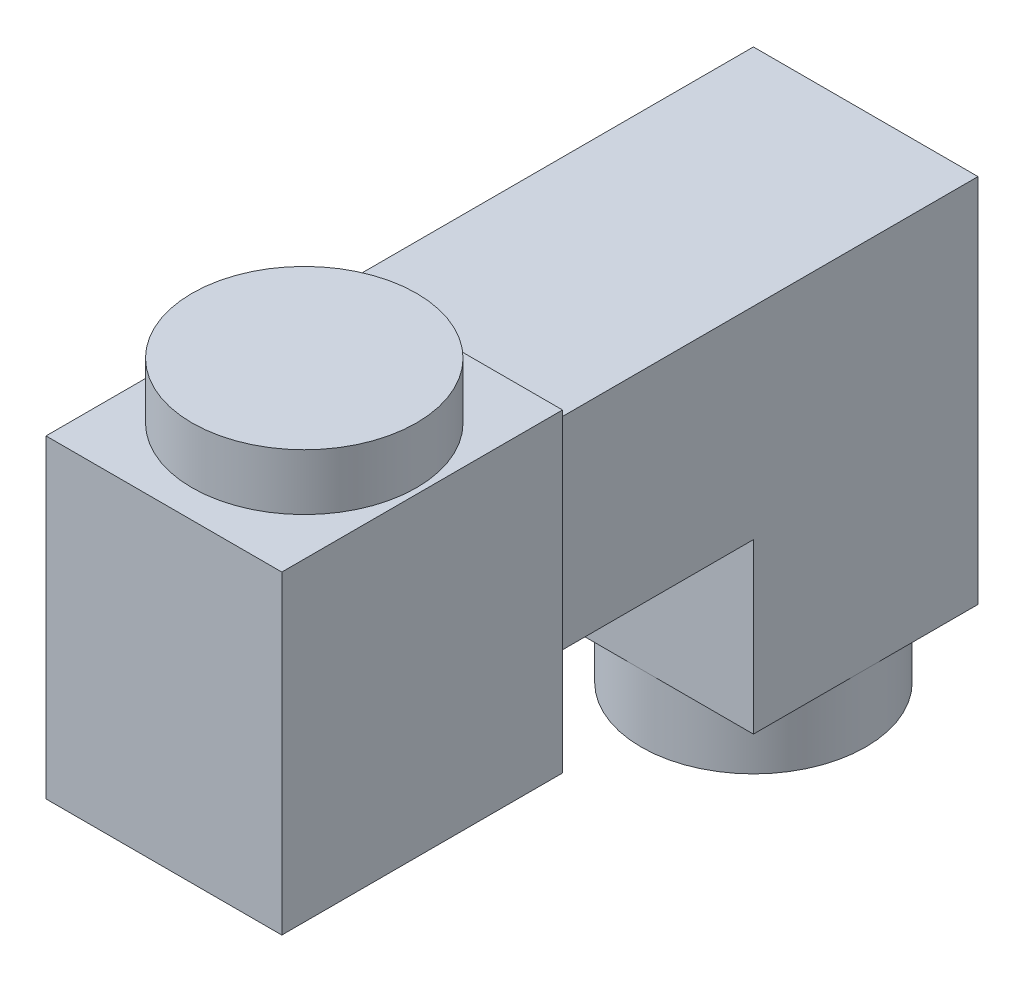
ISO-10303-21;
HEADER;
FILE_DESCRIPTION(('STEP AP214'),'2;1');
FILE_NAME('part.step','',(''),(''),'','','');
FILE_SCHEMA(('AUTOMOTIVE_DESIGN { 1 0 10303 214 1 1 1 1 }'));
ENDSEC;
DATA;
#1=APPLICATION_CONTEXT('core data for automotive mechanical design processes');
#2=APPLICATION_PROTOCOL_DEFINITION('international standard','automotive_design',2000,#1);
#3=PRODUCT_CONTEXT('',#1,'mechanical');
#4=PRODUCT('Part','Part','',(#3));
#5=PRODUCT_RELATED_PRODUCT_CATEGORY('part','',(#4));
#6=PRODUCT_DEFINITION_FORMATION('','',#4);
#7=PRODUCT_DEFINITION_CONTEXT('part definition',#1,'design');
#8=PRODUCT_DEFINITION('design','',#6,#7);
#9=PRODUCT_DEFINITION_SHAPE('','',#8);
#10=(LENGTH_UNIT() NAMED_UNIT(*) SI_UNIT(.MILLI.,.METRE.));
#11=(NAMED_UNIT(*) PLANE_ANGLE_UNIT() SI_UNIT($,.RADIAN.));
#12=(NAMED_UNIT(*) SI_UNIT($,.STERADIAN.) SOLID_ANGLE_UNIT());
#13=UNCERTAINTY_MEASURE_WITH_UNIT(LENGTH_MEASURE(1.E-05),#10,'distance_accuracy_value','');
#14=(GEOMETRIC_REPRESENTATION_CONTEXT(3) GLOBAL_UNCERTAINTY_ASSIGNED_CONTEXT((#13)) GLOBAL_UNIT_ASSIGNED_CONTEXT((#10,
#11,#12)) REPRESENTATION_CONTEXT('',''));
#15=CARTESIAN_POINT('',(0.,0.,0.));
#16=DIRECTION('',(0.,0.,1.));
#17=DIRECTION('',(1.,0.,0.));
#18=AXIS2_PLACEMENT_3D('',#15,#16,#17);
#19=CARTESIAN_POINT('',(0.,149.300046999142,0.));
#20=DIRECTION('',(0.,-1.,0.));
#21=DIRECTION('',(0.,0.,-1.));
#22=AXIS2_PLACEMENT_3D('',#19,#20,#21);
#23=PLANE('',#22);
#24=CARTESIAN_POINT('',(10.5,149.300046999142,-196.893217971225));
#25=DIRECTION('',(0.,-1.,0.));
#26=DIRECTION('',(0.,0.,-1.));
#27=AXIS2_PLACEMENT_3D('',#24,#25,#26);
#28=CIRCLE('',#27,10.);
#29=CARTESIAN_POINT('',(10.5,149.300046999142,-206.893217971225));
#30=VERTEX_POINT('',#29);
#31=CARTESIAN_POINT('',(20.5,149.300046999142,-196.893217971225));
#32=VERTEX_POINT('',#31);
#33=EDGE_CURVE('E43',#30,#32,#28,.T.);
#34=ORIENTED_EDGE('',*,*,#33,.F.);
#35=DIRECTION('',(1.,0.,0.));
#36=VECTOR('',#35,1.);
#37=CARTESIAN_POINT('',(0.499999999999995,149.300046999142,-206.893217971225));
#38=LINE('',#37,#36);
#39=CARTESIAN_POINT('',(20.5,149.300046999142,-206.893217971225));
#40=VERTEX_POINT('',#39);
#41=EDGE_CURVE('E132',#30,#40,#38,.T.);
#42=ORIENTED_EDGE('',*,*,#41,.T.);
#43=DIRECTION('',(0.,0.,1.));
#44=VECTOR('',#43,1.);
#45=CARTESIAN_POINT('',(20.5,149.300046999142,-186.893217971225));
#46=LINE('',#45,#44);
#47=EDGE_CURVE('E144',#40,#32,#46,.T.);
#48=ORIENTED_EDGE('',*,*,#47,.T.);
#49=EDGE_LOOP('',(#34,#42,#48));
#50=FACE_BOUND('',#49,.T.);
#51=ADVANCED_FACE('F32',(#50),#23,.T.);
#52=CARTESIAN_POINT('',(10.5,149.300046999142,-186.893217971225));
#53=VERTEX_POINT('',#52);
#54=EDGE_CURVE('E11',#32,#53,#28,.T.);
#55=ORIENTED_EDGE('',*,*,#54,.F.);
#56=CARTESIAN_POINT('',(20.5,149.300046999142,-186.893217971225));
#57=VERTEX_POINT('',#56);
#58=EDGE_CURVE('E131',#32,#57,#46,.T.);
#59=ORIENTED_EDGE('',*,*,#58,.T.);
#60=DIRECTION('',(-1.,0.,0.));
#61=VECTOR('',#60,1.);
#62=CARTESIAN_POINT('',(0.499999999999995,149.300046999142,-186.893217971225));
#63=LINE('',#62,#61);
#64=EDGE_CURVE('E160',#57,#53,#63,.T.);
#65=ORIENTED_EDGE('',*,*,#64,.T.);
#66=EDGE_LOOP('',(#55,#59,#65));
#67=FACE_BOUND('',#66,.T.);
#68=ADVANCED_FACE('F255',(#67),#23,.T.);
#69=CARTESIAN_POINT('',(0.499999999999995,149.300046999142,-196.893217971225));
#70=VERTEX_POINT('',#69);
#71=EDGE_CURVE('E41',#53,#70,#28,.T.);
#72=ORIENTED_EDGE('',*,*,#71,.F.);
#73=CARTESIAN_POINT('',(0.499999999999995,149.300046999142,-186.893217971225));
#74=VERTEX_POINT('',#73);
#75=EDGE_CURVE('E159',#53,#74,#63,.T.);
#76=ORIENTED_EDGE('',*,*,#75,.T.);
#77=DIRECTION('',(0.,0.,-1.));
#78=VECTOR('',#77,1.);
#79=CARTESIAN_POINT('',(0.499999999999995,149.300046999142,-186.893217971225));
#80=LINE('',#79,#78);
#81=EDGE_CURVE('E142',#74,#70,#80,.T.);
#82=ORIENTED_EDGE('',*,*,#81,.T.);
#83=EDGE_LOOP('',(#72,#76,#82));
#84=FACE_BOUND('',#83,.T.);
#85=ADVANCED_FACE('F260',(#84),#23,.T.);
#86=CARTESIAN_POINT('',(20.5,164.300046999142,-206.893217971225));
#87=DIRECTION('',(0.,1.,0.));
#88=DIRECTION('',(0.,0.,1.));
#89=AXIS2_PLACEMENT_3D('',#86,#87,#88);
#90=PLANE('',#89);
#91=DIRECTION('',(-1.,0.,0.));
#92=VECTOR('',#91,1.);
#93=CARTESIAN_POINT('',(0.499999999999995,164.300046999142,-186.893217971225));
#94=LINE('',#93,#92);
#95=CARTESIAN_POINT('',(20.5,164.300046999142,-186.893217971225));
#96=VERTEX_POINT('',#95);
#97=CARTESIAN_POINT('',(0.499999999999995,164.300046999142,-186.893217971225));
#98=VERTEX_POINT('',#97);
#99=EDGE_CURVE('E155',#96,#98,#94,.T.);
#100=ORIENTED_EDGE('',*,*,#99,.F.);
#101=DIRECTION('',(0.,0.,1.));
#102=VECTOR('',#101,1.);
#103=CARTESIAN_POINT('',(20.5,164.300046999142,-206.893217971225));
#104=LINE('',#103,#102);
#105=CARTESIAN_POINT('',(20.5,164.300046999142,-169.393217971225));
#106=VERTEX_POINT('',#105);
#107=EDGE_CURVE('E193',#96,#106,#104,.T.);
#108=ORIENTED_EDGE('',*,*,#107,.T.);
#109=DIRECTION('',(-1.,0.,0.));
#110=VECTOR('',#109,1.);
#111=CARTESIAN_POINT('',(20.5,164.300046999142,-169.393217971225));
#112=LINE('',#111,#110);
#113=CARTESIAN_POINT('',(0.499999999999995,164.300046999142,-169.393217971225));
#114=VERTEX_POINT('',#113);
#115=EDGE_CURVE('E178',#106,#114,#112,.T.);
#116=ORIENTED_EDGE('',*,*,#115,.T.);
#117=DIRECTION('',(0.,0.,1.));
#118=VECTOR('',#117,1.);
#119=CARTESIAN_POINT('',(0.499999999999995,164.300046999142,-206.893217971225));
#120=LINE('',#119,#118);
#121=EDGE_CURVE('E191',#98,#114,#120,.T.);
#122=ORIENTED_EDGE('',*,*,#121,.F.);
#123=EDGE_LOOP('',(#100,#108,#116,#122));
#124=FACE_BOUND('',#123,.T.);
#125=ADVANCED_FACE('F274',(#124),#90,.F.);
#126=CARTESIAN_POINT('',(21.,155.300046999142,-169.393217971225));
#127=DIRECTION('',(0.,0.,1.));
#128=DIRECTION('',(1.,0.,0.));
#129=AXIS2_PLACEMENT_3D('',#126,#127,#128);
#130=PLANE('',#129);
#131=DIRECTION('',(0.,1.,0.));
#132=VECTOR('',#131,1.);
#133=CARTESIAN_POINT('',(0.,155.300046999142,-169.393217971225));
#134=LINE('',#133,#132);
#135=CARTESIAN_POINT('',(0.,155.300046999142,-169.393217971225));
#136=VERTEX_POINT('',#135);
#137=CARTESIAN_POINT('',(0.,183.300046999142,-169.393217971225));
#138=VERTEX_POINT('',#137);
#139=EDGE_CURVE('E211',#136,#138,#134,.T.);
#140=ORIENTED_EDGE('',*,*,#139,.T.);
#141=DIRECTION('',(-1.,0.,0.));
#142=VECTOR('',#141,1.);
#143=CARTESIAN_POINT('',(21.,183.300046999142,-169.393217971225));
#144=LINE('',#143,#142);
#145=CARTESIAN_POINT('',(21.,183.300046999142,-169.393217971225));
#146=VERTEX_POINT('',#145);
#147=EDGE_CURVE('E216',#146,#138,#144,.T.);
#148=ORIENTED_EDGE('',*,*,#147,.F.);
#149=DIRECTION('',(0.,1.,0.));
#150=VECTOR('',#149,1.);
#151=CARTESIAN_POINT('',(21.,155.300046999142,-169.393217971225));
#152=LINE('',#151,#150);
#153=CARTESIAN_POINT('',(21.,155.300046999142,-169.393217971225));
#154=VERTEX_POINT('',#153);
#155=EDGE_CURVE('E202',#154,#146,#152,.T.);
#156=ORIENTED_EDGE('',*,*,#155,.F.);
#157=DIRECTION('',(-1.,0.,0.));
#158=VECTOR('',#157,1.);
#159=CARTESIAN_POINT('',(21.,155.300046999142,-169.393217971225));
#160=LINE('',#159,#158);
#161=EDGE_CURVE('E218',#154,#136,#160,.T.);
#162=ORIENTED_EDGE('',*,*,#161,.T.);
#163=EDGE_LOOP('',(#140,#148,#156,#162));
#164=FACE_BOUND('',#163,.T.);
#165=DIRECTION('',(0.,-1.,0.));
#166=VECTOR('',#165,1.);
#167=CARTESIAN_POINT('',(20.5,182.300046999142,-169.393217971225));
#168=LINE('',#167,#166);
#169=CARTESIAN_POINT('',(20.5,182.300046999142,-169.393217971225));
#170=VERTEX_POINT('',#169);
#171=EDGE_CURVE('E168',#170,#106,#168,.T.);
#172=ORIENTED_EDGE('',*,*,#171,.F.);
#173=DIRECTION('',(1.,0.,0.));
#174=VECTOR('',#173,1.);
#175=CARTESIAN_POINT('',(20.5,182.300046999142,-169.393217971225));
#176=LINE('',#175,#174);
#177=CARTESIAN_POINT('',(0.499999999999995,182.300046999142,-169.393217971225));
#178=VERTEX_POINT('',#177);
#179=EDGE_CURVE('E171',#178,#170,#176,.T.);
#180=ORIENTED_EDGE('',*,*,#179,.F.);
#181=DIRECTION('',(0.,1.,0.));
#182=VECTOR('',#181,1.);
#183=CARTESIAN_POINT('',(0.499999999999995,182.300046999142,-169.393217971225));
#184=LINE('',#183,#182);
#185=EDGE_CURVE('E181',#114,#178,#184,.T.);
#186=ORIENTED_EDGE('',*,*,#185,.F.);
#187=ORIENTED_EDGE('',*,*,#115,.F.);
#188=EDGE_LOOP('',(#172,#180,#186,#187));
#189=FACE_BOUND('',#188,.T.);
#190=ADVANCED_FACE('F236',(#164,#189),#130,.F.);
#191=CARTESIAN_POINT('',(21.,155.300046999142,-144.393217971225));
#192=DIRECTION('',(0.,0.,-1.));
#193=DIRECTION('',(-1.,0.,0.));
#194=AXIS2_PLACEMENT_3D('',#191,#192,#193);
#195=PLANE('',#194);
#196=DIRECTION('',(0.,-1.,0.));
#197=VECTOR('',#196,1.);
#198=CARTESIAN_POINT('',(0.,155.300046999142,-144.393217971225));
#199=LINE('',#198,#197);
#200=CARTESIAN_POINT('',(0.,183.300046999142,-144.393217971225));
#201=VERTEX_POINT('',#200);
#202=CARTESIAN_POINT('',(0.,155.300046999142,-144.393217971225));
#203=VERTEX_POINT('',#202);
#204=EDGE_CURVE('E195',#201,#203,#199,.T.);
#205=ORIENTED_EDGE('',*,*,#204,.T.);
#206=DIRECTION('',(-1.,0.,0.));
#207=VECTOR('',#206,1.);
#208=CARTESIAN_POINT('',(21.,155.300046999142,-144.393217971225));
#209=LINE('',#208,#207);
#210=CARTESIAN_POINT('',(21.,155.300046999142,-144.393217971225));
#211=VERTEX_POINT('',#210);
#212=EDGE_CURVE('E36',#211,#203,#209,.T.);
#213=ORIENTED_EDGE('',*,*,#212,.F.);
#214=DIRECTION('',(0.,-1.,0.));
#215=VECTOR('',#214,1.);
#216=CARTESIAN_POINT('',(21.,155.300046999142,-144.393217971225));
#217=LINE('',#216,#215);
#218=CARTESIAN_POINT('',(21.,183.300046999142,-144.393217971225));
#219=VERTEX_POINT('',#218);
#220=EDGE_CURVE('E196',#219,#211,#217,.T.);
#221=ORIENTED_EDGE('',*,*,#220,.F.);
#222=DIRECTION('',(-1.,0.,0.));
#223=VECTOR('',#222,1.);
#224=CARTESIAN_POINT('',(21.,183.300046999142,-144.393217971225));
#225=LINE('',#224,#223);
#226=EDGE_CURVE('E206',#219,#201,#225,.T.);
#227=ORIENTED_EDGE('',*,*,#226,.T.);
#228=EDGE_LOOP('',(#205,#213,#221,#227));
#229=FACE_BOUND('',#228,.T.);
#230=ADVANCED_FACE('F34',(#229),#195,.F.);
#231=CARTESIAN_POINT('',(21.,155.300046999142,-144.393217971225));
#232=DIRECTION('',(0.,1.,0.));
#233=DIRECTION('',(0.,0.,1.));
#234=AXIS2_PLACEMENT_3D('',#231,#232,#233);
#235=PLANE('',#234);
#236=DIRECTION('',(0.,0.,-1.));
#237=VECTOR('',#236,1.);
#238=CARTESIAN_POINT('',(0.,155.300046999142,-144.393217971225));
#239=LINE('',#238,#237);
#240=EDGE_CURVE('E209',#203,#136,#239,.T.);
#241=ORIENTED_EDGE('',*,*,#240,.T.);
#242=ORIENTED_EDGE('',*,*,#161,.F.);
#243=DIRECTION('',(0.,0.,-1.));
#244=VECTOR('',#243,1.);
#245=CARTESIAN_POINT('',(21.,155.300046999142,-144.393217971225));
#246=LINE('',#245,#244);
#247=EDGE_CURVE('E199',#211,#154,#246,.T.);
#248=ORIENTED_EDGE('',*,*,#247,.F.);
#249=ORIENTED_EDGE('',*,*,#212,.T.);
#250=EDGE_LOOP('',(#241,#242,#248,#249));
#251=FACE_BOUND('',#250,.T.);
#252=ADVANCED_FACE('F227',(#251),#235,.F.);
#253=CARTESIAN_POINT('',(21.,183.300046999142,-144.393217971225));
#254=DIRECTION('',(0.,-1.,0.));
#255=DIRECTION('',(0.,0.,-1.));
#256=AXIS2_PLACEMENT_3D('',#253,#254,#255);
#257=PLANE('',#256);
#258=CARTESIAN_POINT('',(10.5,183.300046999142,-156.893217971225));
#259=DIRECTION('',(0.,1.,0.));
#260=DIRECTION('',(0.,0.,1.));
#261=AXIS2_PLACEMENT_3D('',#258,#259,#260);
#262=CIRCLE('',#261,10.);
#263=CARTESIAN_POINT('',(10.5,183.300046999142,-146.893217971225));
#264=VERTEX_POINT('',#263);
#265=EDGE_CURVE('E148',#264,#264,#262,.T.);
#266=ORIENTED_EDGE('',*,*,#265,.F.);
#267=EDGE_LOOP('',(#266));
#268=FACE_BOUND('',#267,.T.);
#269=DIRECTION('',(0.,0.,1.));
#270=VECTOR('',#269,1.);
#271=CARTESIAN_POINT('',(0.,183.300046999142,-144.393217971225));
#272=LINE('',#271,#270);
#273=EDGE_CURVE('E200',#138,#201,#272,.T.);
#274=ORIENTED_EDGE('',*,*,#273,.T.);
#275=ORIENTED_EDGE('',*,*,#226,.F.);
#276=DIRECTION('',(0.,0.,1.));
#277=VECTOR('',#276,1.);
#278=CARTESIAN_POINT('',(21.,183.300046999142,-144.393217971225));
#279=LINE('',#278,#277);
#280=EDGE_CURVE('E204',#146,#219,#279,.T.);
#281=ORIENTED_EDGE('',*,*,#280,.F.);
#282=ORIENTED_EDGE('',*,*,#147,.T.);
#283=EDGE_LOOP('',(#274,#275,#281,#282));
#284=FACE_BOUND('',#283,.T.);
#285=ADVANCED_FACE('F240',(#268,#284),#257,.F.);
#286=CARTESIAN_POINT('',(21.,0.,0.));
#287=DIRECTION('',(-1.,0.,0.));
#288=DIRECTION('',(0.,0.,1.));
#289=AXIS2_PLACEMENT_3D('',#286,#287,#288);
#290=PLANE('',#289);
#291=ORIENTED_EDGE('',*,*,#220,.T.);
#292=ORIENTED_EDGE('',*,*,#247,.T.);
#293=ORIENTED_EDGE('',*,*,#155,.T.);
#294=ORIENTED_EDGE('',*,*,#280,.T.);
#295=EDGE_LOOP('',(#291,#292,#293,#294));
#296=FACE_BOUND('',#295,.T.);
#297=ADVANCED_FACE('F242',(#296),#290,.F.);
#298=CARTESIAN_POINT('',(0.,0.,0.));
#299=DIRECTION('',(-1.,0.,0.));
#300=DIRECTION('',(0.,0.,1.));
#301=AXIS2_PLACEMENT_3D('',#298,#299,#300);
#302=PLANE('',#301);
#303=ORIENTED_EDGE('',*,*,#204,.F.);
#304=ORIENTED_EDGE('',*,*,#273,.F.);
#305=ORIENTED_EDGE('',*,*,#139,.F.);
#306=ORIENTED_EDGE('',*,*,#240,.F.);
#307=EDGE_LOOP('',(#303,#304,#305,#306));
#308=FACE_BOUND('',#307,.T.);
#309=ADVANCED_FACE('F234',(#308),#302,.T.);
#310=CARTESIAN_POINT('',(20.5,182.300046999142,-206.893217971225));
#311=DIRECTION('',(-1.,0.,0.));
#312=DIRECTION('',(0.,-1.,0.));
#313=AXIS2_PLACEMENT_3D('',#310,#311,#312);
#314=PLANE('',#313);
#315=ORIENTED_EDGE('',*,*,#171,.T.);
#316=ORIENTED_EDGE('',*,*,#107,.F.);
#317=DIRECTION('',(0.,1.,0.));
#318=VECTOR('',#317,1.);
#319=CARTESIAN_POINT('',(20.5,149.300046999142,-186.893217971225));
#320=LINE('',#319,#318);
#321=EDGE_CURVE('E166',#57,#96,#320,.T.);
#322=ORIENTED_EDGE('',*,*,#321,.F.);
#323=ORIENTED_EDGE('',*,*,#58,.F.);
#324=ORIENTED_EDGE('',*,*,#47,.F.);
#325=DIRECTION('',(0.,-1.,0.));
#326=VECTOR('',#325,1.);
#327=CARTESIAN_POINT('',(20.5,182.300046999142,-206.893217971225));
#328=LINE('',#327,#326);
#329=CARTESIAN_POINT('',(20.5,182.300046999142,-206.893217971225));
#330=VERTEX_POINT('',#329);
#331=EDGE_CURVE('E138',#330,#40,#328,.T.);
#332=ORIENTED_EDGE('',*,*,#331,.F.);
#333=DIRECTION('',(0.,0.,1.));
#334=VECTOR('',#333,1.);
#335=CARTESIAN_POINT('',(20.5,182.300046999142,-206.893217971225));
#336=LINE('',#335,#334);
#337=EDGE_CURVE('E175',#330,#170,#336,.T.);
#338=ORIENTED_EDGE('',*,*,#337,.T.);
#339=EDGE_LOOP('',(#315,#316,#322,#323,#324,#332,#338));
#340=FACE_BOUND('',#339,.T.);
#341=ADVANCED_FACE('F249',(#340),#314,.F.);
#342=CARTESIAN_POINT('',(0.499999999999995,182.300046999142,-206.893217971225));
#343=DIRECTION('',(1.,0.,0.));
#344=DIRECTION('',(0.,1.,0.));
#345=AXIS2_PLACEMENT_3D('',#342,#343,#344);
#346=PLANE('',#345);
#347=ORIENTED_EDGE('',*,*,#185,.T.);
#348=DIRECTION('',(0.,0.,1.));
#349=VECTOR('',#348,1.);
#350=CARTESIAN_POINT('',(0.499999999999995,182.300046999142,-206.893217971225));
#351=LINE('',#350,#349);
#352=CARTESIAN_POINT('',(0.499999999999995,182.300046999142,-206.893217971225));
#353=VERTEX_POINT('',#352);
#354=EDGE_CURVE('E188',#353,#178,#351,.T.);
#355=ORIENTED_EDGE('',*,*,#354,.F.);
#356=DIRECTION('',(0.,1.,0.));
#357=VECTOR('',#356,1.);
#358=CARTESIAN_POINT('',(0.499999999999995,182.300046999142,-206.893217971225));
#359=LINE('',#358,#357);
#360=CARTESIAN_POINT('',(0.499999999999995,149.300046999142,-206.893217971225));
#361=VERTEX_POINT('',#360);
#362=EDGE_CURVE('E170',#361,#353,#359,.T.);
#363=ORIENTED_EDGE('',*,*,#362,.F.);
#364=EDGE_CURVE('E128',#70,#361,#80,.T.);
#365=ORIENTED_EDGE('',*,*,#364,.F.);
#366=ORIENTED_EDGE('',*,*,#81,.F.);
#367=DIRECTION('',(0.,1.,0.));
#368=VECTOR('',#367,1.);
#369=CARTESIAN_POINT('',(0.499999999999995,149.300046999142,-186.893217971225));
#370=LINE('',#369,#368);
#371=EDGE_CURVE('E162',#74,#98,#370,.T.);
#372=ORIENTED_EDGE('',*,*,#371,.T.);
#373=ORIENTED_EDGE('',*,*,#121,.T.);
#374=EDGE_LOOP('',(#347,#355,#363,#365,#366,#372,#373));
#375=FACE_BOUND('',#374,.T.);
#376=ADVANCED_FACE('F286',(#375),#346,.F.);
#377=CARTESIAN_POINT('',(20.5,182.300046999142,-206.893217971225));
#378=DIRECTION('',(0.,-1.,0.));
#379=DIRECTION('',(0.,0.,-1.));
#380=AXIS2_PLACEMENT_3D('',#377,#378,#379);
#381=PLANE('',#380);
#382=ORIENTED_EDGE('',*,*,#179,.T.);
#383=ORIENTED_EDGE('',*,*,#337,.F.);
#384=DIRECTION('',(1.,0.,0.));
#385=VECTOR('',#384,1.);
#386=CARTESIAN_POINT('',(20.5,182.300046999142,-206.893217971225));
#387=LINE('',#386,#385);
#388=EDGE_CURVE('E173',#353,#330,#387,.T.);
#389=ORIENTED_EDGE('',*,*,#388,.F.);
#390=ORIENTED_EDGE('',*,*,#354,.T.);
#391=EDGE_LOOP('',(#382,#383,#389,#390));
#392=FACE_BOUND('',#391,.T.);
#393=ADVANCED_FACE('F293',(#392),#381,.F.);
#394=CARTESIAN_POINT('',(0.,0.,-206.893217971225));
#395=DIRECTION('',(0.,0.,-1.));
#396=DIRECTION('',(-1.,0.,0.));
#397=AXIS2_PLACEMENT_3D('',#394,#395,#396);
#398=PLANE('',#397);
#399=ORIENTED_EDGE('',*,*,#331,.T.);
#400=ORIENTED_EDGE('',*,*,#41,.F.);
#401=EDGE_CURVE('E122',#361,#30,#38,.T.);
#402=ORIENTED_EDGE('',*,*,#401,.F.);
#403=ORIENTED_EDGE('',*,*,#362,.T.);
#404=ORIENTED_EDGE('',*,*,#388,.T.);
#405=EDGE_LOOP('',(#399,#400,#402,#403,#404));
#406=FACE_BOUND('',#405,.T.);
#407=ADVANCED_FACE('F136',(#406),#398,.T.);
#408=CARTESIAN_POINT('',(0.499999999999995,149.300046999142,-186.893217971225));
#409=DIRECTION('',(0.,0.,-1.));
#410=DIRECTION('',(-1.,0.,0.));
#411=AXIS2_PLACEMENT_3D('',#408,#409,#410);
#412=PLANE('',#411);
#413=ORIENTED_EDGE('',*,*,#99,.T.);
#414=ORIENTED_EDGE('',*,*,#371,.F.);
#415=ORIENTED_EDGE('',*,*,#75,.F.);
#416=ORIENTED_EDGE('',*,*,#64,.F.);
#417=ORIENTED_EDGE('',*,*,#321,.T.);
#418=EDGE_LOOP('',(#413,#414,#415,#416,#417));
#419=FACE_BOUND('',#418,.T.);
#420=ADVANCED_FACE('F265',(#419),#412,.F.);
#421=EDGE_CURVE('E126',#70,#30,#28,.T.);
#422=ORIENTED_EDGE('',*,*,#421,.F.);
#423=ORIENTED_EDGE('',*,*,#364,.T.);
#424=ORIENTED_EDGE('',*,*,#401,.T.);
#425=EDGE_LOOP('',(#422,#423,#424));
#426=FACE_BOUND('',#425,.T.);
#427=ADVANCED_FACE('F124',(#426),#23,.T.);
#428=CARTESIAN_POINT('',(10.5,188.300046999142,-156.893217971225));
#429=DIRECTION('',(0.,-1.,0.));
#430=DIRECTION('',(0.,0.,-1.));
#431=AXIS2_PLACEMENT_3D('',#428,#429,#430);
#432=CYLINDRICAL_SURFACE('',#431,10.);
#433=CARTESIAN_POINT('',(10.5,188.300046999142,-156.893217971225));
#434=DIRECTION('',(0.,1.,0.));
#435=DIRECTION('',(0.,0.,1.));
#436=AXIS2_PLACEMENT_3D('',#433,#434,#435);
#437=CIRCLE('',#436,10.);
#438=CARTESIAN_POINT('',(10.5,188.300046999142,-146.893217971225));
#439=VERTEX_POINT('',#438);
#440=EDGE_CURVE('E153',#439,#439,#437,.T.);
#441=ORIENTED_EDGE('',*,*,#440,.F.);
#442=EDGE_LOOP('',(#441));
#443=FACE_BOUND('',#442,.T.);
#444=ORIENTED_EDGE('',*,*,#265,.T.);
#445=EDGE_LOOP('',(#444));
#446=FACE_BOUND('',#445,.T.);
#447=ADVANCED_FACE('F264',(#443,#446),#432,.T.);
#448=CARTESIAN_POINT('',(10.5,188.300046999142,-156.893217971225));
#449=DIRECTION('',(0.,1.,0.));
#450=DIRECTION('',(0.,0.,1.));
#451=AXIS2_PLACEMENT_3D('',#448,#449,#450);
#452=PLANE('',#451);
#453=ORIENTED_EDGE('',*,*,#440,.T.);
#454=EDGE_LOOP('',(#453));
#455=FACE_BOUND('',#454,.T.);
#456=ADVANCED_FACE('F270',(#455),#452,.T.);
#457=CARTESIAN_POINT('',(10.5,143.300046999142,-196.893217971225));
#458=DIRECTION('',(0.,1.,0.));
#459=DIRECTION('',(0.,0.,1.));
#460=AXIS2_PLACEMENT_3D('',#457,#458,#459);
#461=CYLINDRICAL_SURFACE('',#460,10.);
#462=CARTESIAN_POINT('',(10.5,143.300046999142,-196.893217971225));
#463=DIRECTION('',(0.,-1.,0.));
#464=DIRECTION('',(0.,0.,-1.));
#465=AXIS2_PLACEMENT_3D('',#462,#463,#464);
#466=CIRCLE('',#465,10.);
#467=CARTESIAN_POINT('',(10.5,143.300046999142,-206.893217971225));
#468=VERTEX_POINT('',#467);
#469=EDGE_CURVE('E146',#468,#468,#466,.T.);
#470=ORIENTED_EDGE('',*,*,#469,.F.);
#471=EDGE_LOOP('',(#470));
#472=FACE_BOUND('',#471,.T.);
#473=ORIENTED_EDGE('',*,*,#33,.T.);
#474=ORIENTED_EDGE('',*,*,#54,.T.);
#475=ORIENTED_EDGE('',*,*,#71,.T.);
#476=ORIENTED_EDGE('',*,*,#421,.T.);
#477=EDGE_LOOP('',(#473,#474,#475,#476));
#478=FACE_BOUND('',#477,.T.);
#479=ADVANCED_FACE('F147',(#472,#478),#461,.T.);
#480=CARTESIAN_POINT('',(10.5,143.300046999142,-196.893217971225));
#481=DIRECTION('',(0.,-1.,0.));
#482=DIRECTION('',(0.,0.,-1.));
#483=AXIS2_PLACEMENT_3D('',#480,#481,#482);
#484=PLANE('',#483);
#485=ORIENTED_EDGE('',*,*,#469,.T.);
#486=EDGE_LOOP('',(#485));
#487=FACE_BOUND('',#486,.T.);
#488=ADVANCED_FACE('F333',(#487),#484,.T.);
#489=CLOSED_SHELL('',(#51,#68,#85,#125,#190,#230,#252,#285,#297,#309,#341,#376,#393,#407,#420,
#427,#447,#456,#479,#488));
#490=MANIFOLD_SOLID_BREP('B2',#489);
#491=ADVANCED_BREP_SHAPE_REPRESENTATION('',(#18,#490),#14);
#492=SHAPE_DEFINITION_REPRESENTATION(#9,#491);
ENDSEC;
END-ISO-10303-21;
